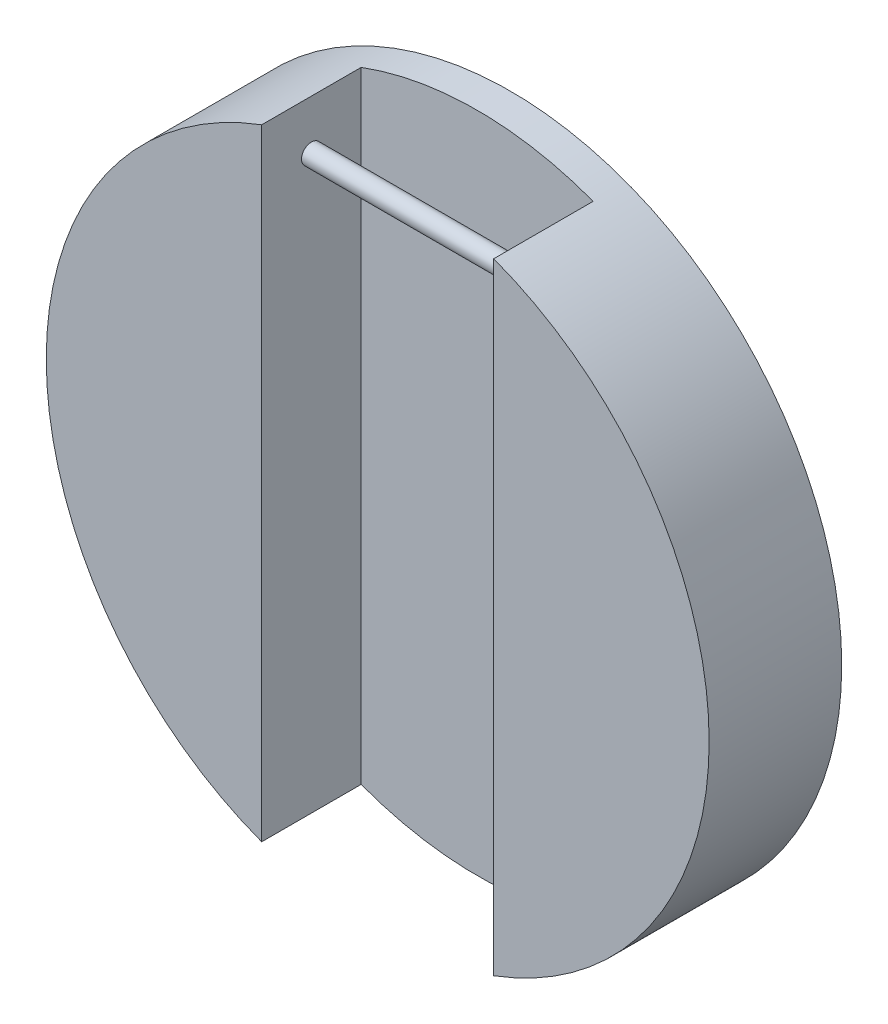
ISO-10303-21;
HEADER;
FILE_DESCRIPTION(('STEP AP214'),'2;1');
FILE_NAME('part.step','',(''),(''),'','','');
FILE_SCHEMA(('AUTOMOTIVE_DESIGN { 1 0 10303 214 1 1 1 1 }'));
ENDSEC;
DATA;
#1=APPLICATION_CONTEXT('core data for automotive mechanical design processes');
#2=APPLICATION_PROTOCOL_DEFINITION('international standard','automotive_design',2000,#1);
#3=PRODUCT_CONTEXT('',#1,'mechanical');
#4=PRODUCT('Part','Part','',(#3));
#5=PRODUCT_RELATED_PRODUCT_CATEGORY('part','',(#4));
#6=PRODUCT_DEFINITION_FORMATION('','',#4);
#7=PRODUCT_DEFINITION_CONTEXT('part definition',#1,'design');
#8=PRODUCT_DEFINITION('design','',#6,#7);
#9=PRODUCT_DEFINITION_SHAPE('','',#8);
#10=(LENGTH_UNIT() NAMED_UNIT(*) SI_UNIT(.MILLI.,.METRE.));
#11=(NAMED_UNIT(*) PLANE_ANGLE_UNIT() SI_UNIT($,.RADIAN.));
#12=(NAMED_UNIT(*) SI_UNIT($,.STERADIAN.) SOLID_ANGLE_UNIT());
#13=UNCERTAINTY_MEASURE_WITH_UNIT(LENGTH_MEASURE(1.E-05),#10,'distance_accuracy_value','');
#14=(GEOMETRIC_REPRESENTATION_CONTEXT(3) GLOBAL_UNCERTAINTY_ASSIGNED_CONTEXT((#13)) GLOBAL_UNIT_ASSIGNED_CONTEXT((#10,
#11,#12)) REPRESENTATION_CONTEXT('',''));
#15=CARTESIAN_POINT('',(0.,0.,0.));
#16=DIRECTION('',(0.,0.,1.));
#17=DIRECTION('',(1.,0.,0.));
#18=AXIS2_PLACEMENT_3D('',#15,#16,#17);
#19=CARTESIAN_POINT('',(0.,0.,40.));
#20=DIRECTION('',(0.,0.,1.));
#21=DIRECTION('',(1.,0.,0.));
#22=AXIS2_PLACEMENT_3D('',#19,#20,#21);
#23=PLANE('',#22);
#24=DIRECTION('',(0.,-1.,0.));
#25=VECTOR('',#24,1.);
#26=CARTESIAN_POINT('',(-35.,0.,40.));
#27=LINE('',#26,#25);
#28=CARTESIAN_POINT('',(-35.,93.674969975976,40.));
#29=VERTEX_POINT('',#28);
#30=CARTESIAN_POINT('',(-35.,-93.674969975976,40.));
#31=VERTEX_POINT('',#30);
#32=EDGE_CURVE('E95',#29,#31,#27,.T.);
#33=ORIENTED_EDGE('',*,*,#32,.F.);
#34=CARTESIAN_POINT('',(0.,0.,40.));
#35=DIRECTION('',(0.,0.,1.));
#36=DIRECTION('',(1.,0.,0.));
#37=AXIS2_PLACEMENT_3D('',#34,#35,#36);
#38=CIRCLE('',#37,100.);
#39=EDGE_CURVE('E96',#29,#31,#38,.T.);
#40=ORIENTED_EDGE('',*,*,#39,.T.);
#41=EDGE_LOOP('',(#33,#40));
#42=FACE_BOUND('',#41,.T.);
#43=ADVANCED_FACE('F47',(#42),#23,.T.);
#44=CARTESIAN_POINT('',(0.,0.,40.));
#45=DIRECTION('',(0.,0.,-1.));
#46=DIRECTION('',(-1.,0.,0.));
#47=AXIS2_PLACEMENT_3D('',#44,#45,#46);
#48=CYLINDRICAL_SURFACE('',#47,100.);
#49=ORIENTED_EDGE('',*,*,#39,.F.);
#50=DIRECTION('',(0.,0.,-1.));
#51=VECTOR('',#50,1.);
#52=CARTESIAN_POINT('',(-35.,93.674969975976,40.));
#53=LINE('',#52,#51);
#54=CARTESIAN_POINT('',(-35.,93.674969975976,10.));
#55=VERTEX_POINT('',#54);
#56=EDGE_CURVE('E110',#29,#55,#53,.T.);
#57=ORIENTED_EDGE('',*,*,#56,.T.);
#58=CARTESIAN_POINT('',(0.,0.,10.));
#59=DIRECTION('',(0.,0.,1.));
#60=DIRECTION('',(1.,0.,0.));
#61=AXIS2_PLACEMENT_3D('',#58,#59,#60);
#62=CIRCLE('',#61,100.);
#63=CARTESIAN_POINT('',(35.,93.674969975976,10.));
#64=VERTEX_POINT('',#63);
#65=EDGE_CURVE('E102',#64,#55,#62,.T.);
#66=ORIENTED_EDGE('',*,*,#65,.F.);
#67=DIRECTION('',(0.,0.,-1.));
#68=VECTOR('',#67,1.);
#69=CARTESIAN_POINT('',(35.,93.674969975976,40.));
#70=LINE('',#69,#68);
#71=CARTESIAN_POINT('',(35.,93.674969975976,40.));
#72=VERTEX_POINT('',#71);
#73=EDGE_CURVE('E90',#64,#72,#70,.F.);
#74=ORIENTED_EDGE('',*,*,#73,.T.);
#75=CARTESIAN_POINT('',(35.,-93.674969975976,40.));
#76=VERTEX_POINT('',#75);
#77=EDGE_CURVE('E100',#76,#72,#38,.T.);
#78=ORIENTED_EDGE('',*,*,#77,.F.);
#79=DIRECTION('',(0.,0.,-1.));
#80=VECTOR('',#79,1.);
#81=CARTESIAN_POINT('',(35.,-93.674969975976,40.));
#82=LINE('',#81,#80);
#83=CARTESIAN_POINT('',(35.,-93.674969975976,10.));
#84=VERTEX_POINT('',#83);
#85=EDGE_CURVE('E62',#76,#84,#82,.T.);
#86=ORIENTED_EDGE('',*,*,#85,.T.);
#87=CARTESIAN_POINT('',(-35.,-93.674969975976,10.));
#88=VERTEX_POINT('',#87);
#89=EDGE_CURVE('E69',#88,#84,#62,.T.);
#90=ORIENTED_EDGE('',*,*,#89,.F.);
#91=DIRECTION('',(0.,0.,-1.));
#92=VECTOR('',#91,1.);
#93=CARTESIAN_POINT('',(-35.,-93.674969975976,40.));
#94=LINE('',#93,#92);
#95=EDGE_CURVE('E127',#88,#31,#94,.F.);
#96=ORIENTED_EDGE('',*,*,#95,.T.);
#97=EDGE_LOOP('',(#49,#57,#66,#74,#78,#86,#90,#96));
#98=FACE_BOUND('',#97,.T.);
#99=CARTESIAN_POINT('',(0.,0.,0.));
#100=DIRECTION('',(0.,0.,1.));
#101=DIRECTION('',(1.,0.,0.));
#102=AXIS2_PLACEMENT_3D('',#99,#100,#101);
#103=CIRCLE('',#102,100.);
#104=CARTESIAN_POINT('',(100.,0.,0.));
#105=VERTEX_POINT('',#104);
#106=EDGE_CURVE('E106',#105,#105,#103,.T.);
#107=ORIENTED_EDGE('',*,*,#106,.T.);
#108=EDGE_LOOP('',(#107));
#109=FACE_BOUND('',#108,.T.);
#110=ADVANCED_FACE('F49',(#98,#109),#48,.T.);
#111=DIRECTION('',(0.,1.,0.));
#112=VECTOR('',#111,1.);
#113=CARTESIAN_POINT('',(35.,0.,40.));
#114=LINE('',#113,#112);
#115=EDGE_CURVE('E87',#76,#72,#114,.T.);
#116=ORIENTED_EDGE('',*,*,#115,.F.);
#117=ORIENTED_EDGE('',*,*,#77,.T.);
#118=EDGE_LOOP('',(#116,#117));
#119=FACE_BOUND('',#118,.T.);
#120=ADVANCED_FACE('F105',(#119),#23,.T.);
#121=CARTESIAN_POINT('',(0.,0.,0.));
#122=DIRECTION('',(0.,0.,1.));
#123=DIRECTION('',(1.,0.,0.));
#124=AXIS2_PLACEMENT_3D('',#121,#122,#123);
#125=PLANE('',#124);
#126=ORIENTED_EDGE('',*,*,#106,.F.);
#127=EDGE_LOOP('',(#126));
#128=FACE_BOUND('',#127,.T.);
#129=ADVANCED_FACE('F139',(#128),#125,.F.);
#130=CARTESIAN_POINT('',(0.,0.,10.));
#131=DIRECTION('',(0.,0.,1.));
#132=DIRECTION('',(1.,0.,0.));
#133=AXIS2_PLACEMENT_3D('',#130,#131,#132);
#134=PLANE('',#133);
#135=DIRECTION('',(0.,1.,0.));
#136=VECTOR('',#135,1.);
#137=CARTESIAN_POINT('',(35.,-100.,10.));
#138=LINE('',#137,#136);
#139=EDGE_CURVE('E123',#84,#64,#138,.T.);
#140=ORIENTED_EDGE('',*,*,#139,.T.);
#141=ORIENTED_EDGE('',*,*,#65,.T.);
#142=DIRECTION('',(0.,-1.,0.));
#143=VECTOR('',#142,1.);
#144=CARTESIAN_POINT('',(-35.,100.,10.));
#145=LINE('',#144,#143);
#146=EDGE_CURVE('E103',#55,#88,#145,.T.);
#147=ORIENTED_EDGE('',*,*,#146,.T.);
#148=ORIENTED_EDGE('',*,*,#89,.T.);
#149=EDGE_LOOP('',(#140,#141,#147,#148));
#150=FACE_BOUND('',#149,.T.);
#151=ADVANCED_FACE('F122',(#150),#134,.T.);
#152=CARTESIAN_POINT('',(-35.,100.,10.));
#153=DIRECTION('',(-1.,0.,0.));
#154=DIRECTION('',(0.,0.,1.));
#155=AXIS2_PLACEMENT_3D('',#152,#153,#154);
#156=PLANE('',#155);
#157=CARTESIAN_POINT('',(-35.,78.674969975976,25.));
#158=DIRECTION('',(-1.,0.,0.));
#159=DIRECTION('',(0.,0.,1.));
#160=AXIS2_PLACEMENT_3D('',#157,#158,#159);
#161=CIRCLE('',#160,3.);
#162=CARTESIAN_POINT('',(-35.,78.674969975976,28.));
#163=VERTEX_POINT('',#162);
#164=EDGE_CURVE('E13',#163,#163,#161,.F.);
#165=ORIENTED_EDGE('',*,*,#164,.F.);
#166=EDGE_LOOP('',(#165));
#167=FACE_BOUND('',#166,.T.);
#168=ORIENTED_EDGE('',*,*,#32,.T.);
#169=ORIENTED_EDGE('',*,*,#95,.F.);
#170=ORIENTED_EDGE('',*,*,#146,.F.);
#171=ORIENTED_EDGE('',*,*,#56,.F.);
#172=EDGE_LOOP('',(#168,#169,#170,#171));
#173=FACE_BOUND('',#172,.T.);
#174=ADVANCED_FACE('F125',(#167,#173),#156,.F.);
#175=CARTESIAN_POINT('',(35.,-100.,10.));
#176=DIRECTION('',(1.,0.,0.));
#177=DIRECTION('',(0.,0.,-1.));
#178=AXIS2_PLACEMENT_3D('',#175,#176,#177);
#179=PLANE('',#178);
#180=CARTESIAN_POINT('',(35.,78.674969975976,25.));
#181=DIRECTION('',(1.,0.,0.));
#182=DIRECTION('',(0.,0.,-1.));
#183=AXIS2_PLACEMENT_3D('',#180,#181,#182);
#184=CIRCLE('',#183,3.);
#185=CARTESIAN_POINT('',(35.,78.674969975976,22.));
#186=VERTEX_POINT('',#185);
#187=EDGE_CURVE('E55',#186,#186,#184,.F.);
#188=ORIENTED_EDGE('',*,*,#187,.F.);
#189=EDGE_LOOP('',(#188));
#190=FACE_BOUND('',#189,.T.);
#191=ORIENTED_EDGE('',*,*,#115,.T.);
#192=ORIENTED_EDGE('',*,*,#73,.F.);
#193=ORIENTED_EDGE('',*,*,#139,.F.);
#194=ORIENTED_EDGE('',*,*,#85,.F.);
#195=EDGE_LOOP('',(#191,#192,#193,#194));
#196=FACE_BOUND('',#195,.T.);
#197=ADVANCED_FACE('F89',(#190,#196),#179,.F.);
#198=CARTESIAN_POINT('',(39.,78.674969975976,25.));
#199=DIRECTION('',(-1.,0.,0.));
#200=DIRECTION('',(0.,0.,1.));
#201=AXIS2_PLACEMENT_3D('',#198,#199,#200);
#202=CYLINDRICAL_SURFACE('',#201,3.);
#203=ORIENTED_EDGE('',*,*,#164,.T.);
#204=EDGE_LOOP('',(#203));
#205=FACE_BOUND('',#204,.T.);
#206=ORIENTED_EDGE('',*,*,#187,.T.);
#207=EDGE_LOOP('',(#206));
#208=FACE_BOUND('',#207,.T.);
#209=ADVANCED_FACE('F155',(#205,#208),#202,.T.);
#210=CLOSED_SHELL('',(#43,#110,#120,#129,#151,#174,#197,#209));
#211=MANIFOLD_SOLID_BREP('B2',#210);
#212=ADVANCED_BREP_SHAPE_REPRESENTATION('',(#18,#211),#14);
#213=SHAPE_DEFINITION_REPRESENTATION(#9,#212);
ENDSEC;
END-ISO-10303-21;
